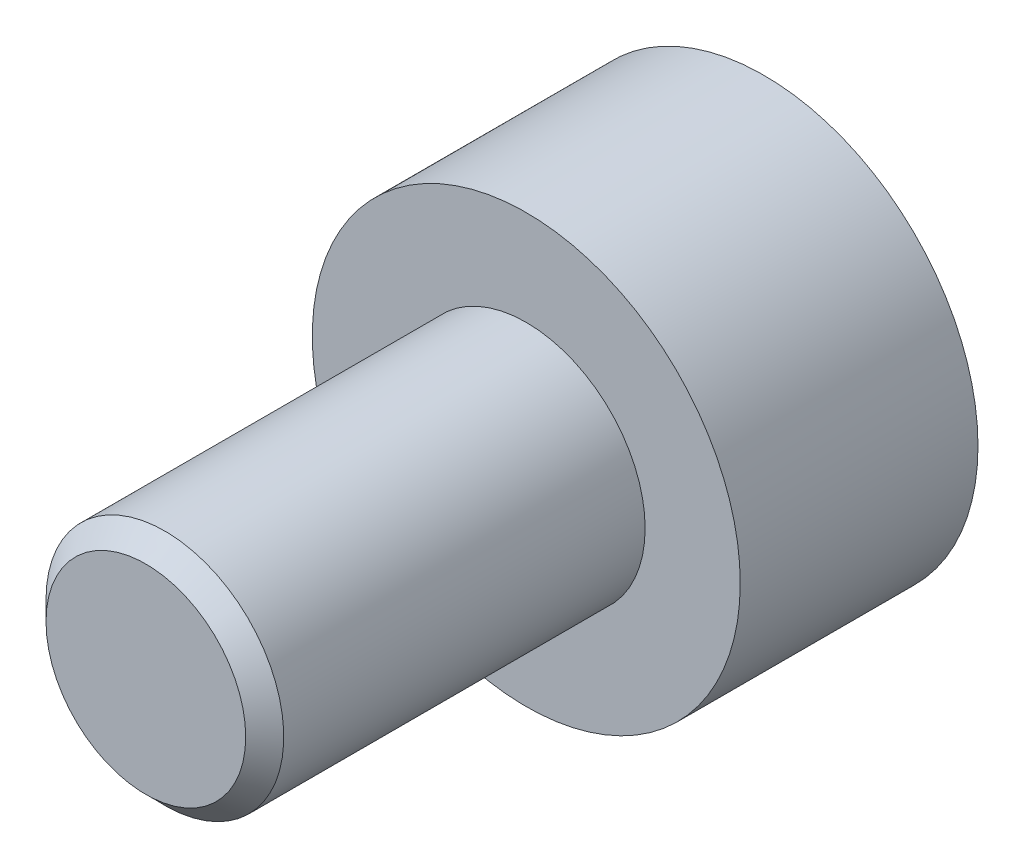
ISO-10303-21;
HEADER;
FILE_DESCRIPTION(('STEP AP214'),'2;1');
FILE_NAME('part.step','',(''),(''),'','','');
FILE_SCHEMA(('AUTOMOTIVE_DESIGN { 1 0 10303 214 1 1 1 1 }'));
ENDSEC;
DATA;
#1=APPLICATION_CONTEXT('core data for automotive mechanical design processes');
#2=APPLICATION_PROTOCOL_DEFINITION('international standard','automotive_design',2000,#1);
#3=PRODUCT_CONTEXT('',#1,'mechanical');
#4=PRODUCT('Part','Part','',(#3));
#5=PRODUCT_RELATED_PRODUCT_CATEGORY('part','',(#4));
#6=PRODUCT_DEFINITION_FORMATION('','',#4);
#7=PRODUCT_DEFINITION_CONTEXT('part definition',#1,'design');
#8=PRODUCT_DEFINITION('design','',#6,#7);
#9=PRODUCT_DEFINITION_SHAPE('','',#8);
#10=(LENGTH_UNIT() NAMED_UNIT(*) SI_UNIT(.MILLI.,.METRE.));
#11=(NAMED_UNIT(*) PLANE_ANGLE_UNIT() SI_UNIT($,.RADIAN.));
#12=(NAMED_UNIT(*) SI_UNIT($,.STERADIAN.) SOLID_ANGLE_UNIT());
#13=UNCERTAINTY_MEASURE_WITH_UNIT(LENGTH_MEASURE(1.E-05),#10,'distance_accuracy_value','');
#14=(GEOMETRIC_REPRESENTATION_CONTEXT(3) GLOBAL_UNCERTAINTY_ASSIGNED_CONTEXT((#13)) GLOBAL_UNIT_ASSIGNED_CONTEXT((#10,
#11,#12)) REPRESENTATION_CONTEXT('',''));
#15=CARTESIAN_POINT('',(0.,0.,0.));
#16=DIRECTION('',(0.,0.,1.));
#17=DIRECTION('',(1.,0.,0.));
#18=AXIS2_PLACEMENT_3D('',#15,#16,#17);
#19=CARTESIAN_POINT('',(0.,0.,2.5));
#20=DIRECTION('',(0.,0.,-1.));
#21=DIRECTION('',(-1.,0.,0.));
#22=AXIS2_PLACEMENT_3D('',#19,#20,#21);
#23=CYLINDRICAL_SURFACE('',#22,2.25);
#24=CARTESIAN_POINT('',(0.,0.,2.5));
#25=DIRECTION('',(0.,0.,1.));
#26=DIRECTION('',(1.,0.,0.));
#27=AXIS2_PLACEMENT_3D('',#24,#25,#26);
#28=CIRCLE('',#27,2.25);
#29=CARTESIAN_POINT('',(2.25,0.,2.5));
#30=VERTEX_POINT('',#29);
#31=EDGE_CURVE('E151',#30,#30,#28,.T.);
#32=ORIENTED_EDGE('',*,*,#31,.F.);
#33=EDGE_LOOP('',(#32));
#34=FACE_BOUND('',#33,.T.);
#35=CARTESIAN_POINT('',(0.,0.,0.));
#36=DIRECTION('',(0.,0.,1.));
#37=DIRECTION('',(1.,0.,0.));
#38=AXIS2_PLACEMENT_3D('',#35,#36,#37);
#39=CIRCLE('',#38,2.25);
#40=CARTESIAN_POINT('',(2.25,0.,0.));
#41=VERTEX_POINT('',#40);
#42=EDGE_CURVE('E142',#41,#41,#39,.T.);
#43=ORIENTED_EDGE('',*,*,#42,.T.);
#44=EDGE_LOOP('',(#43));
#45=FACE_BOUND('',#44,.T.);
#46=ADVANCED_FACE('F39',(#34,#45),#23,.T.);
#47=CARTESIAN_POINT('',(0.,0.,2.5));
#48=DIRECTION('',(0.,0.,1.));
#49=DIRECTION('',(1.,0.,0.));
#50=AXIS2_PLACEMENT_3D('',#47,#48,#49);
#51=PLANE('',#50);
#52=CARTESIAN_POINT('',(0.,0.,2.5));
#53=DIRECTION('',(0.,0.,1.));
#54=DIRECTION('',(1.,0.,0.));
#55=AXIS2_PLACEMENT_3D('',#52,#53,#54);
#56=CIRCLE('',#55,1.25);
#57=CARTESIAN_POINT('',(1.25,0.,2.5));
#58=VERTEX_POINT('',#57);
#59=EDGE_CURVE('E148',#58,#58,#56,.T.);
#60=ORIENTED_EDGE('',*,*,#59,.F.);
#61=EDGE_LOOP('',(#60));
#62=FACE_BOUND('',#61,.T.);
#63=ORIENTED_EDGE('',*,*,#31,.T.);
#64=EDGE_LOOP('',(#63));
#65=FACE_BOUND('',#64,.T.);
#66=ADVANCED_FACE('F173',(#62,#65),#51,.T.);
#67=CARTESIAN_POINT('',(0.,0.,0.));
#68=DIRECTION('',(0.,0.,1.));
#69=DIRECTION('',(1.,0.,0.));
#70=AXIS2_PLACEMENT_3D('',#67,#68,#69);
#71=PLANE('',#70);
#72=DIRECTION('',(0.866025403784439,-0.5,0.));
#73=VECTOR('',#72,1.);
#74=CARTESIAN_POINT('',(0.,1.17779454914684,0.));
#75=LINE('',#74,#73);
#76=CARTESIAN_POINT('',(0.,1.17779454914684,0.));
#77=VERTEX_POINT('',#76);
#78=CARTESIAN_POINT('',(1.02,0.588897274573418,0.));
#79=VERTEX_POINT('',#78);
#80=EDGE_CURVE('E129',#77,#79,#75,.T.);
#81=ORIENTED_EDGE('',*,*,#80,.F.);
#82=DIRECTION('',(0.866025403784439,0.5,0.));
#83=VECTOR('',#82,1.);
#84=CARTESIAN_POINT('',(-1.02,0.588897274573418,0.));
#85=LINE('',#84,#83);
#86=CARTESIAN_POINT('',(-1.02,0.588897274573418,0.));
#87=VERTEX_POINT('',#86);
#88=EDGE_CURVE('E55',#87,#77,#85,.T.);
#89=ORIENTED_EDGE('',*,*,#88,.F.);
#90=DIRECTION('',(0.,1.,0.));
#91=VECTOR('',#90,1.);
#92=CARTESIAN_POINT('',(-1.02,-0.588897274573418,0.));
#93=LINE('',#92,#91);
#94=CARTESIAN_POINT('',(-1.02,-0.588897274573418,0.));
#95=VERTEX_POINT('',#94);
#96=EDGE_CURVE('E138',#95,#87,#93,.T.);
#97=ORIENTED_EDGE('',*,*,#96,.F.);
#98=DIRECTION('',(-0.866025403784439,0.5,0.));
#99=VECTOR('',#98,1.);
#100=CARTESIAN_POINT('',(0.,-1.17779454914684,0.));
#101=LINE('',#100,#99);
#102=CARTESIAN_POINT('',(0.,-1.17779454914684,0.));
#103=VERTEX_POINT('',#102);
#104=EDGE_CURVE('E136',#103,#95,#101,.T.);
#105=ORIENTED_EDGE('',*,*,#104,.F.);
#106=DIRECTION('',(-0.866025403784439,-0.5,0.));
#107=VECTOR('',#106,1.);
#108=CARTESIAN_POINT('',(1.02,-0.588897274573418,0.));
#109=LINE('',#108,#107);
#110=CARTESIAN_POINT('',(1.02,-0.588897274573418,0.));
#111=VERTEX_POINT('',#110);
#112=EDGE_CURVE('E103',#111,#103,#109,.T.);
#113=ORIENTED_EDGE('',*,*,#112,.F.);
#114=DIRECTION('',(0.,-1.,0.));
#115=VECTOR('',#114,1.);
#116=CARTESIAN_POINT('',(1.02,0.588897274573418,0.));
#117=LINE('',#116,#115);
#118=EDGE_CURVE('E132',#79,#111,#117,.T.);
#119=ORIENTED_EDGE('',*,*,#118,.F.);
#120=EDGE_LOOP('',(#81,#89,#97,#105,#113,#119));
#121=FACE_BOUND('',#120,.T.);
#122=ORIENTED_EDGE('',*,*,#42,.F.);
#123=EDGE_LOOP('',(#122));
#124=FACE_BOUND('',#123,.T.);
#125=ADVANCED_FACE('F178',(#121,#124),#71,.F.);
#126=CARTESIAN_POINT('',(0.,0.,6.5));
#127=DIRECTION('',(0.,0.,-1.));
#128=DIRECTION('',(-1.,0.,0.));
#129=AXIS2_PLACEMENT_3D('',#126,#127,#128);
#130=CYLINDRICAL_SURFACE('',#129,1.25);
#131=CARTESIAN_POINT('',(0.,0.,6.3));
#132=DIRECTION('',(0.,0.,1.));
#133=DIRECTION('',(1.,0.,0.));
#134=AXIS2_PLACEMENT_3D('',#131,#132,#133);
#135=CIRCLE('',#134,1.25);
#136=CARTESIAN_POINT('',(-1.25,0.,6.3));
#137=VERTEX_POINT('',#136);
#138=EDGE_CURVE('E11',#137,#137,#135,.F.);
#139=ORIENTED_EDGE('',*,*,#138,.T.);
#140=EDGE_LOOP('',(#139));
#141=FACE_BOUND('',#140,.T.);
#142=ORIENTED_EDGE('',*,*,#59,.T.);
#143=EDGE_LOOP('',(#142));
#144=FACE_BOUND('',#143,.T.);
#145=ADVANCED_FACE('F169',(#141,#144),#130,.T.);
#146=CARTESIAN_POINT('',(0.,0.,6.5));
#147=DIRECTION('',(0.,0.,1.));
#148=DIRECTION('',(1.,0.,0.));
#149=AXIS2_PLACEMENT_3D('',#146,#147,#148);
#150=PLANE('',#149);
#151=CARTESIAN_POINT('',(0.,0.,6.5));
#152=DIRECTION('',(0.,0.,1.));
#153=DIRECTION('',(1.,0.,0.));
#154=AXIS2_PLACEMENT_3D('',#151,#152,#153);
#155=CIRCLE('',#154,1.05);
#156=CARTESIAN_POINT('',(-1.05,0.,6.5));
#157=VERTEX_POINT('',#156);
#158=EDGE_CURVE('E48',#157,#157,#155,.T.);
#159=ORIENTED_EDGE('',*,*,#158,.T.);
#160=EDGE_LOOP('',(#159));
#161=FACE_BOUND('',#160,.T.);
#162=ADVANCED_FACE('F158',(#161),#150,.T.);
#163=CARTESIAN_POINT('',(0.,0.,6.5));
#164=DIRECTION('',(0.,0.,-1.));
#165=DIRECTION('',(-1.,0.,0.));
#166=AXIS2_PLACEMENT_3D('',#163,#164,#165);
#167=CONICAL_SURFACE('',#166,1.05,0.785398163397448);
#168=CARTESIAN_POINT('',(-1.25,0.,6.3));
#169=CARTESIAN_POINT('',(-1.24791666666667,0.,6.30208333333333));
#170=CARTESIAN_POINT('',(-1.24583333333333,0.,6.30416666666667));
#171=CARTESIAN_POINT('',(-1.24166666666667,0.,6.30833333333333));
#172=CARTESIAN_POINT('',(-1.23958333333333,0.,6.31041666666667));
#173=CARTESIAN_POINT('',(-1.23541666666667,0.,6.31458333333333));
#174=CARTESIAN_POINT('',(-1.23333333333333,0.,6.31666666666667));
#175=CARTESIAN_POINT('',(-1.22916666666667,0.,6.32083333333333));
#176=CARTESIAN_POINT('',(-1.22708333333333,0.,6.32291666666667));
#177=CARTESIAN_POINT('',(-1.22291666666667,0.,6.32708333333333));
#178=CARTESIAN_POINT('',(-1.22083333333333,0.,6.32916666666667));
#179=CARTESIAN_POINT('',(-1.21666666666667,0.,6.33333333333333));
#180=CARTESIAN_POINT('',(-1.21458333333333,0.,6.33541666666667));
#181=CARTESIAN_POINT('',(-1.21041666666667,0.,6.33958333333333));
#182=CARTESIAN_POINT('',(-1.20833333333333,0.,6.34166666666667));
#183=CARTESIAN_POINT('',(-1.20416666666667,0.,6.34583333333333));
#184=CARTESIAN_POINT('',(-1.20208333333333,0.,6.34791666666667));
#185=CARTESIAN_POINT('',(-1.19791666666667,0.,6.35208333333333));
#186=CARTESIAN_POINT('',(-1.19583333333333,0.,6.35416666666667));
#187=CARTESIAN_POINT('',(-1.19166666666667,0.,6.35833333333333));
#188=CARTESIAN_POINT('',(-1.18958333333333,0.,6.36041666666667));
#189=CARTESIAN_POINT('',(-1.18541666666667,0.,6.36458333333333));
#190=CARTESIAN_POINT('',(-1.18333333333333,0.,6.36666666666667));
#191=CARTESIAN_POINT('',(-1.17916666666667,0.,6.37083333333333));
#192=CARTESIAN_POINT('',(-1.17708333333333,0.,6.37291666666667));
#193=CARTESIAN_POINT('',(-1.17291666666667,0.,6.37708333333333));
#194=CARTESIAN_POINT('',(-1.17083333333333,0.,6.37916666666667));
#195=CARTESIAN_POINT('',(-1.16666666666667,0.,6.38333333333333));
#196=CARTESIAN_POINT('',(-1.16458333333333,0.,6.38541666666667));
#197=CARTESIAN_POINT('',(-1.16041666666667,0.,6.38958333333333));
#198=CARTESIAN_POINT('',(-1.15833333333333,0.,6.39166666666667));
#199=CARTESIAN_POINT('',(-1.15416666666667,0.,6.39583333333333));
#200=CARTESIAN_POINT('',(-1.15208333333333,0.,6.39791666666667));
#201=CARTESIAN_POINT('',(-1.14791666666667,0.,6.40208333333333));
#202=CARTESIAN_POINT('',(-1.14583333333333,0.,6.40416666666667));
#203=CARTESIAN_POINT('',(-1.14166666666667,0.,6.40833333333333));
#204=CARTESIAN_POINT('',(-1.13958333333333,0.,6.41041666666667));
#205=CARTESIAN_POINT('',(-1.13541666666667,0.,6.41458333333333));
#206=CARTESIAN_POINT('',(-1.13333333333333,0.,6.41666666666667));
#207=CARTESIAN_POINT('',(-1.12916666666667,0.,6.42083333333333));
#208=CARTESIAN_POINT('',(-1.12708333333333,0.,6.42291666666667));
#209=CARTESIAN_POINT('',(-1.12291666666667,0.,6.42708333333333));
#210=CARTESIAN_POINT('',(-1.12083333333333,0.,6.42916666666667));
#211=CARTESIAN_POINT('',(-1.11666666666667,0.,6.43333333333333));
#212=CARTESIAN_POINT('',(-1.11458333333333,0.,6.43541666666667));
#213=CARTESIAN_POINT('',(-1.11041666666667,0.,6.43958333333333));
#214=CARTESIAN_POINT('',(-1.10833333333333,0.,6.44166666666667));
#215=CARTESIAN_POINT('',(-1.10416666666667,0.,6.44583333333333));
#216=CARTESIAN_POINT('',(-1.10208333333333,0.,6.44791666666667));
#217=CARTESIAN_POINT('',(-1.09791666666667,0.,6.45208333333333));
#218=CARTESIAN_POINT('',(-1.09583333333333,0.,6.45416666666667));
#219=CARTESIAN_POINT('',(-1.09166666666667,0.,6.45833333333333));
#220=CARTESIAN_POINT('',(-1.08958333333333,0.,6.46041666666667));
#221=CARTESIAN_POINT('',(-1.08541666666667,0.,6.46458333333333));
#222=CARTESIAN_POINT('',(-1.08333333333333,0.,6.46666666666667));
#223=CARTESIAN_POINT('',(-1.07916666666667,0.,6.47083333333333));
#224=CARTESIAN_POINT('',(-1.07708333333333,0.,6.47291666666667));
#225=CARTESIAN_POINT('',(-1.07291666666667,0.,6.47708333333333));
#226=CARTESIAN_POINT('',(-1.07083333333333,0.,6.47916666666667));
#227=CARTESIAN_POINT('',(-1.06666666666667,0.,6.48333333333333));
#228=CARTESIAN_POINT('',(-1.06458333333333,0.,6.48541666666667));
#229=CARTESIAN_POINT('',(-1.06041666666667,0.,6.48958333333333));
#230=CARTESIAN_POINT('',(-1.05833333333333,0.,6.49166666666667));
#231=CARTESIAN_POINT('',(-1.05416666666667,0.,6.49583333333333));
#232=CARTESIAN_POINT('',(-1.05208333333333,0.,6.49791666666667));
#233=CARTESIAN_POINT('',(-1.05,0.,6.5));
#234=B_SPLINE_CURVE_WITH_KNOTS('',3,(#168,#169,#170,#171,#172,#173,#174,#175,#176,#177,#178,
#179,#180,#181,#182,#183,#184,#185,#186,#187,#188,#189,#190,#191,#192,#193,#194,#195,#196,#197,
#198,#199,#200,#201,#202,#203,#204,#205,#206,#207,#208,#209,#210,#211,#212,#213,#214,#215,#216,
#217,#218,#219,#220,#221,#222,#223,#224,#225,#226,#227,#228,#229,#230,#231,#232,#233),
.UNSPECIFIED.,.F.,.F.,(4,2,2,2,2,2,2,2,2,2,2,2,2,2,2,2,2,2,2,2,2,2,2,2,2,2,2,2,2,2,2,2,4),(0.,
0.00883883476483133,0.0176776695296633,0.0265165042944952,0.0353553390593272,0.0441941738241585,
0.0530330085889906,0.0618718433538225,0.0707106781186545,0.0795495128834864,0.0883883476483177,
0.0972271824131497,0.106066017177982,0.114904851942814,0.123743686707645,0.132582521472477,
0.141421356237309,0.150260191002141,0.159099025766973,0.167937860531804,0.176776695296636,
0.185615530061468,0.1944543648263,0.203293199591131,0.212132034355963,0.220970869120795,
0.229809703885627,0.238648538650459,0.247487373415291,0.256326208180123,0.265165042944954,
0.274003877709786,0.282842712474618),.UNSPECIFIED.);
#235=EDGE_CURVE('BSEAM42',#137,#157,#234,.T.);
#236=ORIENTED_EDGE('',*,*,#138,.F.);
#237=ORIENTED_EDGE('',*,*,#158,.F.);
#238=ORIENTED_EDGE('',*,*,#235,.T.);
#239=ORIENTED_EDGE('',*,*,#235,.F.);
#240=EDGE_LOOP('',(#236,#238,#237,#239));
#241=FACE_BOUND('',#240,.T.);
#242=ADVANCED_FACE('F42',(#241),#167,.T.);
#243=CARTESIAN_POINT('',(-1.02,0.588897274573418,1.1));
#244=DIRECTION('',(-0.5,0.866025403784439,0.));
#245=DIRECTION('',(-0.866025403784439,-0.5,0.));
#246=AXIS2_PLACEMENT_3D('',#243,#244,#245);
#247=PLANE('',#246);
#248=ORIENTED_EDGE('',*,*,#88,.T.);
#249=DIRECTION('',(0.,0.,-1.));
#250=VECTOR('',#249,1.);
#251=CARTESIAN_POINT('',(0.,1.17779454914684,1.1));
#252=LINE('',#251,#250);
#253=CARTESIAN_POINT('',(0.,1.17779454914684,1.1));
#254=VERTEX_POINT('',#253);
#255=EDGE_CURVE('E85',#254,#77,#252,.T.);
#256=ORIENTED_EDGE('',*,*,#255,.F.);
#257=DIRECTION('',(0.866025403784439,0.5,0.));
#258=VECTOR('',#257,1.);
#259=CARTESIAN_POINT('',(-1.02,0.588897274573418,1.1));
#260=LINE('',#259,#258);
#261=CARTESIAN_POINT('',(-1.02,0.588897274573418,1.1));
#262=VERTEX_POINT('',#261);
#263=EDGE_CURVE('E140',#262,#254,#260,.T.);
#264=ORIENTED_EDGE('',*,*,#263,.F.);
#265=DIRECTION('',(0.,0.,-1.));
#266=VECTOR('',#265,1.);
#267=CARTESIAN_POINT('',(-1.02,0.588897274573418,1.1));
#268=LINE('',#267,#266);
#269=EDGE_CURVE('E63',#262,#87,#268,.T.);
#270=ORIENTED_EDGE('',*,*,#269,.T.);
#271=EDGE_LOOP('',(#248,#256,#264,#270));
#272=FACE_BOUND('',#271,.T.);
#273=ADVANCED_FACE('F161',(#272),#247,.F.);
#274=CARTESIAN_POINT('',(-1.02,-0.588897274573418,1.1));
#275=DIRECTION('',(-1.,0.,0.));
#276=DIRECTION('',(0.,0.,1.));
#277=AXIS2_PLACEMENT_3D('',#274,#275,#276);
#278=PLANE('',#277);
#279=ORIENTED_EDGE('',*,*,#96,.T.);
#280=ORIENTED_EDGE('',*,*,#269,.F.);
#281=DIRECTION('',(0.,1.,0.));
#282=VECTOR('',#281,1.);
#283=CARTESIAN_POINT('',(-1.02,-0.588897274573418,1.1));
#284=LINE('',#283,#282);
#285=CARTESIAN_POINT('',(-1.02,-0.588897274573418,1.1));
#286=VERTEX_POINT('',#285);
#287=EDGE_CURVE('E115',#286,#262,#284,.T.);
#288=ORIENTED_EDGE('',*,*,#287,.F.);
#289=DIRECTION('',(0.,0.,-1.));
#290=VECTOR('',#289,1.);
#291=CARTESIAN_POINT('',(-1.02,-0.588897274573418,1.1));
#292=LINE('',#291,#290);
#293=EDGE_CURVE('E107',#286,#95,#292,.T.);
#294=ORIENTED_EDGE('',*,*,#293,.T.);
#295=EDGE_LOOP('',(#279,#280,#288,#294));
#296=FACE_BOUND('',#295,.T.);
#297=ADVANCED_FACE('F167',(#296),#278,.F.);
#298=CARTESIAN_POINT('',(0.,-1.17779454914684,1.1));
#299=DIRECTION('',(-0.5,-0.866025403784439,0.));
#300=DIRECTION('',(0.866025403784439,-0.5,0.));
#301=AXIS2_PLACEMENT_3D('',#298,#299,#300);
#302=PLANE('',#301);
#303=ORIENTED_EDGE('',*,*,#104,.T.);
#304=ORIENTED_EDGE('',*,*,#293,.F.);
#305=DIRECTION('',(-0.866025403784439,0.5,0.));
#306=VECTOR('',#305,1.);
#307=CARTESIAN_POINT('',(0.,-1.17779454914684,1.1));
#308=LINE('',#307,#306);
#309=CARTESIAN_POINT('',(0.,-1.17779454914684,1.1));
#310=VERTEX_POINT('',#309);
#311=EDGE_CURVE('E111',#310,#286,#308,.T.);
#312=ORIENTED_EDGE('',*,*,#311,.F.);
#313=DIRECTION('',(0.,0.,-1.));
#314=VECTOR('',#313,1.);
#315=CARTESIAN_POINT('',(0.,-1.17779454914684,1.1));
#316=LINE('',#315,#314);
#317=EDGE_CURVE('E96',#310,#103,#316,.T.);
#318=ORIENTED_EDGE('',*,*,#317,.T.);
#319=EDGE_LOOP('',(#303,#304,#312,#318));
#320=FACE_BOUND('',#319,.T.);
#321=ADVANCED_FACE('F112',(#320),#302,.F.);
#322=CARTESIAN_POINT('',(1.02,-0.588897274573418,1.1));
#323=DIRECTION('',(0.5,-0.866025403784439,0.));
#324=DIRECTION('',(0.866025403784439,0.5,0.));
#325=AXIS2_PLACEMENT_3D('',#322,#323,#324);
#326=PLANE('',#325);
#327=ORIENTED_EDGE('',*,*,#112,.T.);
#328=ORIENTED_EDGE('',*,*,#317,.F.);
#329=DIRECTION('',(-0.866025403784439,-0.5,0.));
#330=VECTOR('',#329,1.);
#331=CARTESIAN_POINT('',(1.02,-0.588897274573418,1.1));
#332=LINE('',#331,#330);
#333=CARTESIAN_POINT('',(1.02,-0.588897274573418,1.1));
#334=VERTEX_POINT('',#333);
#335=EDGE_CURVE('E100',#334,#310,#332,.T.);
#336=ORIENTED_EDGE('',*,*,#335,.F.);
#337=DIRECTION('',(0.,0.,-1.));
#338=VECTOR('',#337,1.);
#339=CARTESIAN_POINT('',(1.02,-0.588897274573418,1.1));
#340=LINE('',#339,#338);
#341=EDGE_CURVE('E108',#334,#111,#340,.T.);
#342=ORIENTED_EDGE('',*,*,#341,.T.);
#343=EDGE_LOOP('',(#327,#328,#336,#342));
#344=FACE_BOUND('',#343,.T.);
#345=ADVANCED_FACE('F98',(#344),#326,.F.);
#346=CARTESIAN_POINT('',(1.02,0.588897274573418,1.1));
#347=DIRECTION('',(1.,0.,0.));
#348=DIRECTION('',(0.,0.,-1.));
#349=AXIS2_PLACEMENT_3D('',#346,#347,#348);
#350=PLANE('',#349);
#351=ORIENTED_EDGE('',*,*,#118,.T.);
#352=ORIENTED_EDGE('',*,*,#341,.F.);
#353=DIRECTION('',(0.,-1.,0.));
#354=VECTOR('',#353,1.);
#355=CARTESIAN_POINT('',(1.02,0.588897274573418,1.1));
#356=LINE('',#355,#354);
#357=CARTESIAN_POINT('',(1.02,0.588897274573418,1.1));
#358=VERTEX_POINT('',#357);
#359=EDGE_CURVE('E121',#358,#334,#356,.T.);
#360=ORIENTED_EDGE('',*,*,#359,.F.);
#361=DIRECTION('',(0.,0.,-1.));
#362=VECTOR('',#361,1.);
#363=CARTESIAN_POINT('',(1.02,0.588897274573418,1.1));
#364=LINE('',#363,#362);
#365=EDGE_CURVE('E145',#358,#79,#364,.T.);
#366=ORIENTED_EDGE('',*,*,#365,.T.);
#367=EDGE_LOOP('',(#351,#352,#360,#366));
#368=FACE_BOUND('',#367,.T.);
#369=ADVANCED_FACE('F193',(#368),#350,.F.);
#370=CARTESIAN_POINT('',(0.,1.17779454914684,1.1));
#371=DIRECTION('',(0.5,0.866025403784439,0.));
#372=DIRECTION('',(-0.866025403784439,0.5,0.));
#373=AXIS2_PLACEMENT_3D('',#370,#371,#372);
#374=PLANE('',#373);
#375=ORIENTED_EDGE('',*,*,#80,.T.);
#376=ORIENTED_EDGE('',*,*,#365,.F.);
#377=DIRECTION('',(0.866025403784439,-0.5,0.));
#378=VECTOR('',#377,1.);
#379=CARTESIAN_POINT('',(0.,1.17779454914684,1.1));
#380=LINE('',#379,#378);
#381=EDGE_CURVE('E123',#254,#358,#380,.T.);
#382=ORIENTED_EDGE('',*,*,#381,.F.);
#383=ORIENTED_EDGE('',*,*,#255,.T.);
#384=EDGE_LOOP('',(#375,#376,#382,#383));
#385=FACE_BOUND('',#384,.T.);
#386=ADVANCED_FACE('F190',(#385),#374,.F.);
#387=CARTESIAN_POINT('',(0.,0.,1.1));
#388=DIRECTION('',(0.,0.,-1.));
#389=DIRECTION('',(-1.,0.,0.));
#390=AXIS2_PLACEMENT_3D('',#387,#388,#389);
#391=PLANE('',#390);
#392=ORIENTED_EDGE('',*,*,#263,.T.);
#393=ORIENTED_EDGE('',*,*,#381,.T.);
#394=ORIENTED_EDGE('',*,*,#359,.T.);
#395=ORIENTED_EDGE('',*,*,#335,.T.);
#396=ORIENTED_EDGE('',*,*,#311,.T.);
#397=ORIENTED_EDGE('',*,*,#287,.T.);
#398=EDGE_LOOP('',(#392,#393,#394,#395,#396,#397));
#399=FACE_BOUND('',#398,.T.);
#400=ADVANCED_FACE('F118',(#399),#391,.T.);
#401=CLOSED_SHELL('',(#46,#66,#125,#145,#162,#242,#273,#297,#321,#345,#369,#386,#400));
#402=MANIFOLD_SOLID_BREP('B2',#401);
#403=ADVANCED_BREP_SHAPE_REPRESENTATION('',(#18,#402),#14);
#404=SHAPE_DEFINITION_REPRESENTATION(#9,#403);
ENDSEC;
END-ISO-10303-21;
